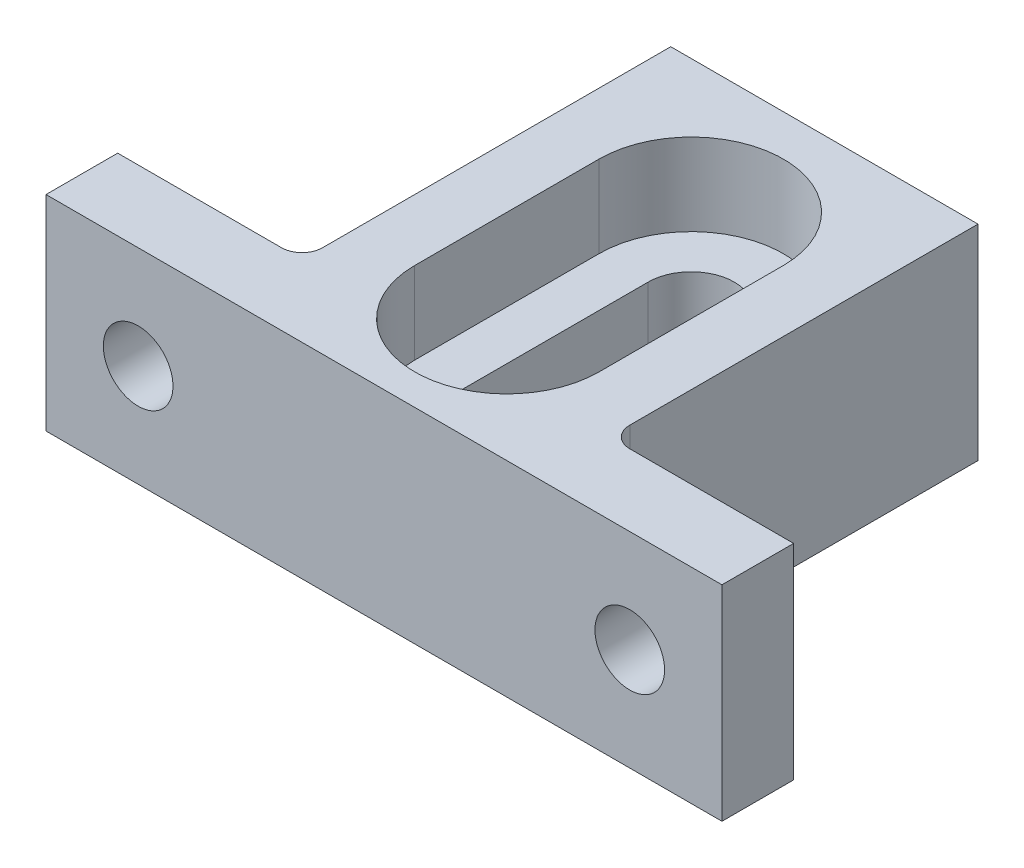
ISO-10303-21;
HEADER;
FILE_DESCRIPTION(('STEP AP214'),'2;1');
FILE_NAME('part.step','',(''),(''),'','','');
FILE_SCHEMA(('AUTOMOTIVE_DESIGN { 1 0 10303 214 1 1 1 1 }'));
ENDSEC;
DATA;
#1=APPLICATION_CONTEXT('core data for automotive mechanical design processes');
#2=APPLICATION_PROTOCOL_DEFINITION('international standard','automotive_design',2000,#1);
#3=PRODUCT_CONTEXT('',#1,'mechanical');
#4=PRODUCT('Part','Part','',(#3));
#5=PRODUCT_RELATED_PRODUCT_CATEGORY('part','',(#4));
#6=PRODUCT_DEFINITION_FORMATION('','',#4);
#7=PRODUCT_DEFINITION_CONTEXT('part definition',#1,'design');
#8=PRODUCT_DEFINITION('design','',#6,#7);
#9=PRODUCT_DEFINITION_SHAPE('','',#8);
#10=(LENGTH_UNIT() NAMED_UNIT(*) SI_UNIT(.MILLI.,.METRE.));
#11=(NAMED_UNIT(*) PLANE_ANGLE_UNIT() SI_UNIT($,.RADIAN.));
#12=(NAMED_UNIT(*) SI_UNIT($,.STERADIAN.) SOLID_ANGLE_UNIT());
#13=UNCERTAINTY_MEASURE_WITH_UNIT(LENGTH_MEASURE(1.E-05),#10,'distance_accuracy_value','');
#14=(GEOMETRIC_REPRESENTATION_CONTEXT(3) GLOBAL_UNCERTAINTY_ASSIGNED_CONTEXT((#13)) GLOBAL_UNIT_ASSIGNED_CONTEXT((#10,
#11,#12)) REPRESENTATION_CONTEXT('',''));
#15=CARTESIAN_POINT('',(0.,0.,0.));
#16=DIRECTION('',(0.,0.,1.));
#17=DIRECTION('',(1.,0.,0.));
#18=AXIS2_PLACEMENT_3D('',#15,#16,#17);
#19=CARTESIAN_POINT('',(-7.5,-5.,-3.5));
#20=DIRECTION('',(0.,0.,-1.));
#21=DIRECTION('',(-1.,0.,0.));
#22=AXIS2_PLACEMENT_3D('',#19,#20,#21);
#23=PLANE('',#22);
#24=CARTESIAN_POINT('',(-12.,0.,-3.5));
#25=DIRECTION('',(0.,0.,-1.));
#26=DIRECTION('',(-1.,0.,0.));
#27=AXIS2_PLACEMENT_3D('',#24,#25,#26);
#28=CIRCLE('',#27,1.7);
#29=CARTESIAN_POINT('',(-13.7,0.,-3.5));
#30=VERTEX_POINT('',#29);
#31=EDGE_CURVE('E183',#30,#30,#28,.T.);
#32=ORIENTED_EDGE('',*,*,#31,.F.);
#33=EDGE_LOOP('',(#32));
#34=FACE_BOUND('',#33,.T.);
#35=DIRECTION('',(-1.,0.,0.));
#36=VECTOR('',#35,1.);
#37=CARTESIAN_POINT('',(-7.5,5.,-3.5));
#38=LINE('',#37,#36);
#39=CARTESIAN_POINT('',(-8.5,5.,-3.5));
#40=VERTEX_POINT('',#39);
#41=CARTESIAN_POINT('',(-16.5,5.,-3.5));
#42=VERTEX_POINT('',#41);
#43=EDGE_CURVE('E221',#40,#42,#38,.T.);
#44=ORIENTED_EDGE('',*,*,#43,.F.);
#45=DIRECTION('',(0.,1.,0.));
#46=VECTOR('',#45,1.);
#47=CARTESIAN_POINT('',(-8.5,-5.,-3.5));
#48=LINE('',#47,#46);
#49=CARTESIAN_POINT('',(-8.5,-5.,-3.5));
#50=VERTEX_POINT('',#49);
#51=EDGE_CURVE('E296',#40,#50,#48,.F.);
#52=ORIENTED_EDGE('',*,*,#51,.T.);
#53=DIRECTION('',(-1.,0.,0.));
#54=VECTOR('',#53,1.);
#55=CARTESIAN_POINT('',(-7.5,-5.,-3.5));
#56=LINE('',#55,#54);
#57=CARTESIAN_POINT('',(-16.5,-5.,-3.5));
#58=VERTEX_POINT('',#57);
#59=EDGE_CURVE('E228',#50,#58,#56,.T.);
#60=ORIENTED_EDGE('',*,*,#59,.T.);
#61=DIRECTION('',(0.,1.,0.));
#62=VECTOR('',#61,1.);
#63=CARTESIAN_POINT('',(-16.5,-5.,-3.5));
#64=LINE('',#63,#62);
#65=EDGE_CURVE('E251',#58,#42,#64,.T.);
#66=ORIENTED_EDGE('',*,*,#65,.T.);
#67=EDGE_LOOP('',(#44,#52,#60,#66));
#68=FACE_BOUND('',#67,.T.);
#69=ADVANCED_FACE('F31',(#34,#68),#23,.T.);
#70=CARTESIAN_POINT('',(-7.5,-5.,-21.5));
#71=DIRECTION('',(-1.,0.,0.));
#72=DIRECTION('',(0.,0.,1.));
#73=AXIS2_PLACEMENT_3D('',#70,#71,#72);
#74=PLANE('',#73);
#75=DIRECTION('',(0.,0.,1.));
#76=VECTOR('',#75,1.);
#77=CARTESIAN_POINT('',(-7.5,-5.,-21.5));
#78=LINE('',#77,#76);
#79=CARTESIAN_POINT('',(-7.5,-5.,-21.5));
#80=VERTEX_POINT('',#79);
#81=CARTESIAN_POINT('',(-7.5,-5.,-4.5));
#82=VERTEX_POINT('',#81);
#83=EDGE_CURVE('E248',#80,#82,#78,.T.);
#84=ORIENTED_EDGE('',*,*,#83,.T.);
#85=DIRECTION('',(0.,1.,0.));
#86=VECTOR('',#85,1.);
#87=CARTESIAN_POINT('',(-7.5,5.,-4.5));
#88=LINE('',#87,#86);
#89=CARTESIAN_POINT('',(-7.5,5.,-4.5));
#90=VERTEX_POINT('',#89);
#91=EDGE_CURVE('E293',#82,#90,#88,.T.);
#92=ORIENTED_EDGE('',*,*,#91,.T.);
#93=DIRECTION('',(0.,0.,1.));
#94=VECTOR('',#93,1.);
#95=CARTESIAN_POINT('',(-7.5,5.,-21.5));
#96=LINE('',#95,#94);
#97=CARTESIAN_POINT('',(-7.5,5.,-21.5));
#98=VERTEX_POINT('',#97);
#99=EDGE_CURVE('E231',#98,#90,#96,.T.);
#100=ORIENTED_EDGE('',*,*,#99,.F.);
#101=DIRECTION('',(0.,1.,0.));
#102=VECTOR('',#101,1.);
#103=CARTESIAN_POINT('',(-7.5,-5.,-21.5));
#104=LINE('',#103,#102);
#105=EDGE_CURVE('E271',#80,#98,#104,.T.);
#106=ORIENTED_EDGE('',*,*,#105,.F.);
#107=EDGE_LOOP('',(#84,#92,#100,#106));
#108=FACE_BOUND('',#107,.T.);
#109=ADVANCED_FACE('F314',(#108),#74,.T.);
#110=CARTESIAN_POINT('',(-7.5,-5.,-21.5));
#111=DIRECTION('',(0.,0.,-1.));
#112=DIRECTION('',(-1.,0.,0.));
#113=AXIS2_PLACEMENT_3D('',#110,#111,#112);
#114=PLANE('',#113);
#115=DIRECTION('',(-1.,0.,0.));
#116=VECTOR('',#115,1.);
#117=CARTESIAN_POINT('',(-7.5,5.,-21.5));
#118=LINE('',#117,#116);
#119=CARTESIAN_POINT('',(7.5,5.,-21.5));
#120=VERTEX_POINT('',#119);
#121=EDGE_CURVE('E266',#120,#98,#118,.T.);
#122=ORIENTED_EDGE('',*,*,#121,.F.);
#123=DIRECTION('',(0.,1.,0.));
#124=VECTOR('',#123,1.);
#125=CARTESIAN_POINT('',(7.5,-5.,-21.5));
#126=LINE('',#125,#124);
#127=CARTESIAN_POINT('',(7.5,-5.,-21.5));
#128=VERTEX_POINT('',#127);
#129=EDGE_CURVE('E274',#128,#120,#126,.T.);
#130=ORIENTED_EDGE('',*,*,#129,.F.);
#131=DIRECTION('',(-1.,0.,0.));
#132=VECTOR('',#131,1.);
#133=CARTESIAN_POINT('',(-7.5,-5.,-21.5));
#134=LINE('',#133,#132);
#135=EDGE_CURVE('E245',#128,#80,#134,.T.);
#136=ORIENTED_EDGE('',*,*,#135,.T.);
#137=ORIENTED_EDGE('',*,*,#105,.T.);
#138=EDGE_LOOP('',(#122,#130,#136,#137));
#139=FACE_BOUND('',#138,.T.);
#140=ADVANCED_FACE('F343',(#139),#114,.T.);
#141=CARTESIAN_POINT('',(7.5,-5.,-21.5));
#142=DIRECTION('',(1.,0.,0.));
#143=DIRECTION('',(0.,0.,-1.));
#144=AXIS2_PLACEMENT_3D('',#141,#142,#143);
#145=PLANE('',#144);
#146=DIRECTION('',(0.,0.,-1.));
#147=VECTOR('',#146,1.);
#148=CARTESIAN_POINT('',(7.5,5.,-21.5));
#149=LINE('',#148,#147);
#150=CARTESIAN_POINT('',(7.5,5.,-4.5));
#151=VERTEX_POINT('',#150);
#152=EDGE_CURVE('E264',#151,#120,#149,.T.);
#153=ORIENTED_EDGE('',*,*,#152,.F.);
#154=DIRECTION('',(0.,1.,0.));
#155=VECTOR('',#154,1.);
#156=CARTESIAN_POINT('',(7.5,-5.,-4.5));
#157=LINE('',#156,#155);
#158=CARTESIAN_POINT('',(7.5,-5.,-4.5));
#159=VERTEX_POINT('',#158);
#160=EDGE_CURVE('E46',#151,#159,#157,.F.);
#161=ORIENTED_EDGE('',*,*,#160,.T.);
#162=DIRECTION('',(0.,0.,-1.));
#163=VECTOR('',#162,1.);
#164=CARTESIAN_POINT('',(7.5,-5.,-21.5));
#165=LINE('',#164,#163);
#166=EDGE_CURVE('E243',#159,#128,#165,.T.);
#167=ORIENTED_EDGE('',*,*,#166,.T.);
#168=ORIENTED_EDGE('',*,*,#129,.T.);
#169=EDGE_LOOP('',(#153,#161,#167,#168));
#170=FACE_BOUND('',#169,.T.);
#171=ADVANCED_FACE('F340',(#170),#145,.T.);
#172=CARTESIAN_POINT('',(7.5,-5.,-3.5));
#173=DIRECTION('',(0.,0.,-1.));
#174=DIRECTION('',(-1.,0.,0.));
#175=AXIS2_PLACEMENT_3D('',#172,#173,#174);
#176=PLANE('',#175);
#177=CARTESIAN_POINT('',(12.,0.,-3.5));
#178=DIRECTION('',(0.,0.,-1.));
#179=DIRECTION('',(-1.,0.,0.));
#180=AXIS2_PLACEMENT_3D('',#177,#178,#179);
#181=CIRCLE('',#180,1.7);
#182=CARTESIAN_POINT('',(10.3,0.,-3.5));
#183=VERTEX_POINT('',#182);
#184=EDGE_CURVE('E557',#183,#183,#181,.T.);
#185=ORIENTED_EDGE('',*,*,#184,.F.);
#186=EDGE_LOOP('',(#185));
#187=FACE_BOUND('',#186,.T.);
#188=DIRECTION('',(-1.,0.,0.));
#189=VECTOR('',#188,1.);
#190=CARTESIAN_POINT('',(7.5,-5.,-3.5));
#191=LINE('',#190,#189);
#192=CARTESIAN_POINT('',(16.5,-5.,-3.5));
#193=VERTEX_POINT('',#192);
#194=CARTESIAN_POINT('',(8.5,-5.,-3.5));
#195=VERTEX_POINT('',#194);
#196=EDGE_CURVE('E240',#193,#195,#191,.T.);
#197=ORIENTED_EDGE('',*,*,#196,.T.);
#198=DIRECTION('',(0.,1.,0.));
#199=VECTOR('',#198,1.);
#200=CARTESIAN_POINT('',(8.5,5.,-3.5));
#201=LINE('',#200,#199);
#202=CARTESIAN_POINT('',(8.5,5.,-3.5));
#203=VERTEX_POINT('',#202);
#204=EDGE_CURVE('E298',#195,#203,#201,.T.);
#205=ORIENTED_EDGE('',*,*,#204,.T.);
#206=DIRECTION('',(-1.,0.,0.));
#207=VECTOR('',#206,1.);
#208=CARTESIAN_POINT('',(7.5,5.,-3.5));
#209=LINE('',#208,#207);
#210=CARTESIAN_POINT('',(16.5,5.,-3.5));
#211=VERTEX_POINT('',#210);
#212=EDGE_CURVE('E262',#211,#203,#209,.T.);
#213=ORIENTED_EDGE('',*,*,#212,.F.);
#214=DIRECTION('',(0.,1.,0.));
#215=VECTOR('',#214,1.);
#216=CARTESIAN_POINT('',(16.5,-5.,-3.5));
#217=LINE('',#216,#215);
#218=EDGE_CURVE('E277',#193,#211,#217,.T.);
#219=ORIENTED_EDGE('',*,*,#218,.F.);
#220=EDGE_LOOP('',(#197,#205,#213,#219));
#221=FACE_BOUND('',#220,.T.);
#222=ADVANCED_FACE('F335',(#187,#221),#176,.T.);
#223=CARTESIAN_POINT('',(16.5,-5.,-3.5));
#224=DIRECTION('',(1.,0.,0.));
#225=DIRECTION('',(0.,0.,-1.));
#226=AXIS2_PLACEMENT_3D('',#223,#224,#225);
#227=PLANE('',#226);
#228=DIRECTION('',(0.,0.,-1.));
#229=VECTOR('',#228,1.);
#230=CARTESIAN_POINT('',(16.5,5.,-3.5));
#231=LINE('',#230,#229);
#232=CARTESIAN_POINT('',(16.5,5.,0.));
#233=VERTEX_POINT('',#232);
#234=EDGE_CURVE('E259',#233,#211,#231,.T.);
#235=ORIENTED_EDGE('',*,*,#234,.F.);
#236=DIRECTION('',(0.,1.,0.));
#237=VECTOR('',#236,1.);
#238=CARTESIAN_POINT('',(16.5,-5.,0.));
#239=LINE('',#238,#237);
#240=CARTESIAN_POINT('',(16.5,-5.,0.));
#241=VERTEX_POINT('',#240);
#242=EDGE_CURVE('E279',#241,#233,#239,.T.);
#243=ORIENTED_EDGE('',*,*,#242,.F.);
#244=DIRECTION('',(0.,0.,-1.));
#245=VECTOR('',#244,1.);
#246=CARTESIAN_POINT('',(16.5,-5.,-3.5));
#247=LINE('',#246,#245);
#248=EDGE_CURVE('E237',#241,#193,#247,.T.);
#249=ORIENTED_EDGE('',*,*,#248,.T.);
#250=ORIENTED_EDGE('',*,*,#218,.T.);
#251=EDGE_LOOP('',(#235,#243,#249,#250));
#252=FACE_BOUND('',#251,.T.);
#253=ADVANCED_FACE('F331',(#252),#227,.T.);
#254=CARTESIAN_POINT('',(16.5,-5.,0.));
#255=DIRECTION('',(0.,0.,1.));
#256=DIRECTION('',(1.,0.,0.));
#257=AXIS2_PLACEMENT_3D('',#254,#255,#256);
#258=PLANE('',#257);
#259=CARTESIAN_POINT('',(12.,0.,0.));
#260=DIRECTION('',(0.,0.,-1.));
#261=DIRECTION('',(-1.,0.,0.));
#262=AXIS2_PLACEMENT_3D('',#259,#260,#261);
#263=CIRCLE('',#262,1.7);
#264=CARTESIAN_POINT('',(10.3,0.,0.));
#265=VERTEX_POINT('',#264);
#266=EDGE_CURVE('E553',#265,#265,#263,.T.);
#267=ORIENTED_EDGE('',*,*,#266,.T.);
#268=EDGE_LOOP('',(#267));
#269=FACE_BOUND('',#268,.T.);
#270=CARTESIAN_POINT('',(-12.,0.,0.));
#271=DIRECTION('',(0.,0.,-1.));
#272=DIRECTION('',(-1.,0.,0.));
#273=AXIS2_PLACEMENT_3D('',#270,#271,#272);
#274=CIRCLE('',#273,1.7);
#275=CARTESIAN_POINT('',(-13.7,0.,0.));
#276=VERTEX_POINT('',#275);
#277=EDGE_CURVE('E180',#276,#276,#274,.T.);
#278=ORIENTED_EDGE('',*,*,#277,.T.);
#279=EDGE_LOOP('',(#278));
#280=FACE_BOUND('',#279,.T.);
#281=DIRECTION('',(1.,0.,0.));
#282=VECTOR('',#281,1.);
#283=CARTESIAN_POINT('',(16.5,5.,0.));
#284=LINE('',#283,#282);
#285=CARTESIAN_POINT('',(-16.5,5.,0.));
#286=VERTEX_POINT('',#285);
#287=EDGE_CURVE('E256',#286,#233,#284,.T.);
#288=ORIENTED_EDGE('',*,*,#287,.F.);
#289=DIRECTION('',(0.,1.,0.));
#290=VECTOR('',#289,1.);
#291=CARTESIAN_POINT('',(-16.5,-5.,0.));
#292=LINE('',#291,#290);
#293=CARTESIAN_POINT('',(-16.5,-5.,0.));
#294=VERTEX_POINT('',#293);
#295=EDGE_CURVE('E281',#294,#286,#292,.T.);
#296=ORIENTED_EDGE('',*,*,#295,.F.);
#297=DIRECTION('',(1.,0.,0.));
#298=VECTOR('',#297,1.);
#299=CARTESIAN_POINT('',(16.5,-5.,0.));
#300=LINE('',#299,#298);
#301=EDGE_CURVE('E234',#294,#241,#300,.T.);
#302=ORIENTED_EDGE('',*,*,#301,.T.);
#303=ORIENTED_EDGE('',*,*,#242,.T.);
#304=EDGE_LOOP('',(#288,#296,#302,#303));
#305=FACE_BOUND('',#304,.T.);
#306=ADVANCED_FACE('F327',(#269,#280,#305),#258,.T.);
#307=CARTESIAN_POINT('',(-16.5,-5.,-3.5));
#308=DIRECTION('',(-1.,0.,0.));
#309=DIRECTION('',(0.,0.,1.));
#310=AXIS2_PLACEMENT_3D('',#307,#308,#309);
#311=PLANE('',#310);
#312=DIRECTION('',(0.,0.,1.));
#313=VECTOR('',#312,1.);
#314=CARTESIAN_POINT('',(-16.5,5.,-3.5));
#315=LINE('',#314,#313);
#316=EDGE_CURVE('E253',#42,#286,#315,.T.);
#317=ORIENTED_EDGE('',*,*,#316,.F.);
#318=ORIENTED_EDGE('',*,*,#65,.F.);
#319=DIRECTION('',(0.,0.,1.));
#320=VECTOR('',#319,1.);
#321=CARTESIAN_POINT('',(-16.5,-5.,-3.5));
#322=LINE('',#321,#320);
#323=EDGE_CURVE('E230',#58,#294,#322,.T.);
#324=ORIENTED_EDGE('',*,*,#323,.T.);
#325=ORIENTED_EDGE('',*,*,#295,.T.);
#326=EDGE_LOOP('',(#317,#318,#324,#325));
#327=FACE_BOUND('',#326,.T.);
#328=ADVANCED_FACE('F323',(#327),#311,.T.);
#329=CARTESIAN_POINT('',(-16.5,-5.,-3.5));
#330=DIRECTION('',(0.,1.,0.));
#331=DIRECTION('',(0.,0.,1.));
#332=AXIS2_PLACEMENT_3D('',#329,#330,#331);
#333=PLANE('',#332);
#334=DIRECTION('',(0.,0.,1.));
#335=VECTOR('',#334,1.);
#336=CARTESIAN_POINT('',(-2.1,-5.,-6.));
#337=LINE('',#336,#335);
#338=CARTESIAN_POINT('',(-2.1,-5.,-15.));
#339=VERTEX_POINT('',#338);
#340=CARTESIAN_POINT('',(-2.1,-5.,-6.));
#341=VERTEX_POINT('',#340);
#342=EDGE_CURVE('E166',#339,#341,#337,.T.);
#343=ORIENTED_EDGE('',*,*,#342,.T.);
#344=CARTESIAN_POINT('',(0.,-5.,-6.));
#345=DIRECTION('',(0.,1.,0.));
#346=DIRECTION('',(0.,0.,-1.));
#347=AXIS2_PLACEMENT_3D('',#344,#345,#346);
#348=CIRCLE('',#347,2.1);
#349=CARTESIAN_POINT('',(2.1,-5.,-6.));
#350=VERTEX_POINT('',#349);
#351=EDGE_CURVE('E159',#341,#350,#348,.T.);
#352=ORIENTED_EDGE('',*,*,#351,.T.);
#353=DIRECTION('',(0.,0.,-1.));
#354=VECTOR('',#353,1.);
#355=CARTESIAN_POINT('',(2.1,-5.,-6.));
#356=LINE('',#355,#354);
#357=CARTESIAN_POINT('',(2.1,-5.,-15.));
#358=VERTEX_POINT('',#357);
#359=EDGE_CURVE('E170',#350,#358,#356,.T.);
#360=ORIENTED_EDGE('',*,*,#359,.T.);
#361=CARTESIAN_POINT('',(0.,-5.,-15.));
#362=DIRECTION('',(0.,1.,0.));
#363=DIRECTION('',(0.,0.,1.));
#364=AXIS2_PLACEMENT_3D('',#361,#362,#363);
#365=CIRCLE('',#364,2.1);
#366=EDGE_CURVE('E175',#358,#339,#365,.T.);
#367=ORIENTED_EDGE('',*,*,#366,.T.);
#368=EDGE_LOOP('',(#343,#352,#360,#367));
#369=FACE_BOUND('',#368,.T.);
#370=ORIENTED_EDGE('',*,*,#59,.F.);
#371=CARTESIAN_POINT('',(-8.5,-5.,-4.5));
#372=DIRECTION('',(0.,1.,0.));
#373=DIRECTION('',(0.,0.,1.));
#374=AXIS2_PLACEMENT_3D('',#371,#372,#373);
#375=CIRCLE('',#374,1.);
#376=EDGE_CURVE('E304',#50,#82,#375,.T.);
#377=ORIENTED_EDGE('',*,*,#376,.T.);
#378=ORIENTED_EDGE('',*,*,#83,.F.);
#379=ORIENTED_EDGE('',*,*,#135,.F.);
#380=ORIENTED_EDGE('',*,*,#166,.F.);
#381=CARTESIAN_POINT('',(8.5,-5.,-4.5));
#382=DIRECTION('',(0.,1.,0.));
#383=DIRECTION('',(0.,0.,1.));
#384=AXIS2_PLACEMENT_3D('',#381,#382,#383);
#385=CIRCLE('',#384,1.);
#386=EDGE_CURVE('E11',#159,#195,#385,.T.);
#387=ORIENTED_EDGE('',*,*,#386,.T.);
#388=ORIENTED_EDGE('',*,*,#196,.F.);
#389=ORIENTED_EDGE('',*,*,#248,.F.);
#390=ORIENTED_EDGE('',*,*,#301,.F.);
#391=ORIENTED_EDGE('',*,*,#323,.F.);
#392=EDGE_LOOP('',(#370,#377,#378,#379,#380,#387,#388,#389,#390,#391));
#393=FACE_BOUND('',#392,.T.);
#394=ADVANCED_FACE('F177',(#369,#393),#333,.F.);
#395=CARTESIAN_POINT('',(-16.5,5.,-3.5));
#396=DIRECTION('',(0.,1.,0.));
#397=DIRECTION('',(0.,0.,1.));
#398=AXIS2_PLACEMENT_3D('',#395,#396,#397);
#399=PLANE('',#398);
#400=CARTESIAN_POINT('',(0.,5.,-6.));
#401=DIRECTION('',(0.,1.,0.));
#402=DIRECTION('',(0.,0.,-1.));
#403=AXIS2_PLACEMENT_3D('',#400,#401,#402);
#404=CIRCLE('',#403,4.5);
#405=CARTESIAN_POINT('',(-4.5,5.,-6.));
#406=VERTEX_POINT('',#405);
#407=CARTESIAN_POINT('',(4.5,5.,-6.));
#408=VERTEX_POINT('',#407);
#409=EDGE_CURVE('E191',#406,#408,#404,.T.);
#410=ORIENTED_EDGE('',*,*,#409,.F.);
#411=DIRECTION('',(0.,0.,1.));
#412=VECTOR('',#411,1.);
#413=CARTESIAN_POINT('',(-4.5,5.,-6.));
#414=LINE('',#413,#412);
#415=CARTESIAN_POINT('',(-4.5,5.,-15.));
#416=VERTEX_POINT('',#415);
#417=EDGE_CURVE('E200',#416,#406,#414,.T.);
#418=ORIENTED_EDGE('',*,*,#417,.F.);
#419=CARTESIAN_POINT('',(0.,5.,-15.));
#420=DIRECTION('',(0.,1.,0.));
#421=DIRECTION('',(0.,0.,1.));
#422=AXIS2_PLACEMENT_3D('',#419,#420,#421);
#423=CIRCLE('',#422,4.5);
#424=CARTESIAN_POINT('',(4.5,5.,-15.));
#425=VERTEX_POINT('',#424);
#426=EDGE_CURVE('E214',#425,#416,#423,.T.);
#427=ORIENTED_EDGE('',*,*,#426,.F.);
#428=DIRECTION('',(0.,0.,-1.));
#429=VECTOR('',#428,1.);
#430=CARTESIAN_POINT('',(4.5,5.,-6.));
#431=LINE('',#430,#429);
#432=EDGE_CURVE('E211',#408,#425,#431,.T.);
#433=ORIENTED_EDGE('',*,*,#432,.F.);
#434=EDGE_LOOP('',(#410,#418,#427,#433));
#435=FACE_BOUND('',#434,.T.);
#436=ORIENTED_EDGE('',*,*,#99,.T.);
#437=CARTESIAN_POINT('',(-8.5,5.,-4.5));
#438=DIRECTION('',(0.,1.,0.));
#439=DIRECTION('',(0.,0.,1.));
#440=AXIS2_PLACEMENT_3D('',#437,#438,#439);
#441=CIRCLE('',#440,1.);
#442=EDGE_CURVE('E302',#90,#40,#441,.F.);
#443=ORIENTED_EDGE('',*,*,#442,.T.);
#444=ORIENTED_EDGE('',*,*,#43,.T.);
#445=ORIENTED_EDGE('',*,*,#316,.T.);
#446=ORIENTED_EDGE('',*,*,#287,.T.);
#447=ORIENTED_EDGE('',*,*,#234,.T.);
#448=ORIENTED_EDGE('',*,*,#212,.T.);
#449=CARTESIAN_POINT('',(8.5,5.,-4.5));
#450=DIRECTION('',(0.,1.,0.));
#451=DIRECTION('',(0.,0.,1.));
#452=AXIS2_PLACEMENT_3D('',#449,#450,#451);
#453=CIRCLE('',#452,1.);
#454=EDGE_CURVE('E39',#203,#151,#453,.F.);
#455=ORIENTED_EDGE('',*,*,#454,.T.);
#456=ORIENTED_EDGE('',*,*,#152,.T.);
#457=ORIENTED_EDGE('',*,*,#121,.T.);
#458=EDGE_LOOP('',(#436,#443,#444,#445,#446,#447,#448,#455,#456,#457));
#459=FACE_BOUND('',#458,.T.);
#460=ADVANCED_FACE('F318',(#435,#459),#399,.T.);
#461=CARTESIAN_POINT('',(0.,1.,-6.));
#462=DIRECTION('',(0.,1.,0.));
#463=DIRECTION('',(0.,0.,1.));
#464=AXIS2_PLACEMENT_3D('',#461,#462,#463);
#465=CYLINDRICAL_SURFACE('',#464,4.5);
#466=ORIENTED_EDGE('',*,*,#409,.T.);
#467=DIRECTION('',(0.,1.,0.));
#468=VECTOR('',#467,1.);
#469=CARTESIAN_POINT('',(4.5,1.,-6.));
#470=LINE('',#469,#468);
#471=CARTESIAN_POINT('',(4.5,1.,-6.));
#472=VERTEX_POINT('',#471);
#473=EDGE_CURVE('E209',#472,#408,#470,.T.);
#474=ORIENTED_EDGE('',*,*,#473,.F.);
#475=CARTESIAN_POINT('',(0.,1.,-6.));
#476=DIRECTION('',(0.,1.,0.));
#477=DIRECTION('',(0.,0.,-1.));
#478=AXIS2_PLACEMENT_3D('',#475,#476,#477);
#479=CIRCLE('',#478,4.5);
#480=CARTESIAN_POINT('',(-4.5,1.,-6.));
#481=VERTEX_POINT('',#480);
#482=EDGE_CURVE('E196',#481,#472,#479,.T.);
#483=ORIENTED_EDGE('',*,*,#482,.F.);
#484=DIRECTION('',(0.,1.,0.));
#485=VECTOR('',#484,1.);
#486=CARTESIAN_POINT('',(-4.5,1.,-6.));
#487=LINE('',#486,#485);
#488=EDGE_CURVE('E219',#481,#406,#487,.T.);
#489=ORIENTED_EDGE('',*,*,#488,.T.);
#490=EDGE_LOOP('',(#466,#474,#483,#489));
#491=FACE_BOUND('',#490,.T.);
#492=ADVANCED_FACE('F398',(#491),#465,.F.);
#493=CARTESIAN_POINT('',(-4.5,1.,-6.));
#494=DIRECTION('',(-1.,0.,0.));
#495=DIRECTION('',(0.,0.,1.));
#496=AXIS2_PLACEMENT_3D('',#493,#494,#495);
#497=PLANE('',#496);
#498=ORIENTED_EDGE('',*,*,#417,.T.);
#499=ORIENTED_EDGE('',*,*,#488,.F.);
#500=DIRECTION('',(0.,0.,1.));
#501=VECTOR('',#500,1.);
#502=CARTESIAN_POINT('',(-4.5,1.,-6.));
#503=LINE('',#502,#501);
#504=CARTESIAN_POINT('',(-4.5,1.,-15.));
#505=VERTEX_POINT('',#504);
#506=EDGE_CURVE('E206',#505,#481,#503,.T.);
#507=ORIENTED_EDGE('',*,*,#506,.F.);
#508=DIRECTION('',(0.,1.,0.));
#509=VECTOR('',#508,1.);
#510=CARTESIAN_POINT('',(-4.5,1.,-15.));
#511=LINE('',#510,#509);
#512=EDGE_CURVE('E222',#505,#416,#511,.T.);
#513=ORIENTED_EDGE('',*,*,#512,.T.);
#514=EDGE_LOOP('',(#498,#499,#507,#513));
#515=FACE_BOUND('',#514,.T.);
#516=ADVANCED_FACE('F394',(#515),#497,.F.);
#517=CARTESIAN_POINT('',(0.,1.,-15.));
#518=DIRECTION('',(0.,1.,0.));
#519=DIRECTION('',(0.,0.,1.));
#520=AXIS2_PLACEMENT_3D('',#517,#518,#519);
#521=CYLINDRICAL_SURFACE('',#520,4.5);
#522=ORIENTED_EDGE('',*,*,#426,.T.);
#523=ORIENTED_EDGE('',*,*,#512,.F.);
#524=CARTESIAN_POINT('',(0.,1.,-15.));
#525=DIRECTION('',(0.,1.,0.));
#526=DIRECTION('',(0.,0.,1.));
#527=AXIS2_PLACEMENT_3D('',#524,#525,#526);
#528=CIRCLE('',#527,4.5);
#529=CARTESIAN_POINT('',(4.5,1.,-15.));
#530=VERTEX_POINT('',#529);
#531=EDGE_CURVE('E203',#530,#505,#528,.T.);
#532=ORIENTED_EDGE('',*,*,#531,.F.);
#533=DIRECTION('',(0.,1.,0.));
#534=VECTOR('',#533,1.);
#535=CARTESIAN_POINT('',(4.5,1.,-15.));
#536=LINE('',#535,#534);
#537=EDGE_CURVE('E224',#530,#425,#536,.T.);
#538=ORIENTED_EDGE('',*,*,#537,.T.);
#539=EDGE_LOOP('',(#522,#523,#532,#538));
#540=FACE_BOUND('',#539,.T.);
#541=ADVANCED_FACE('F397',(#540),#521,.F.);
#542=CARTESIAN_POINT('',(4.5,1.,-6.));
#543=DIRECTION('',(1.,0.,0.));
#544=DIRECTION('',(0.,0.,-1.));
#545=AXIS2_PLACEMENT_3D('',#542,#543,#544);
#546=PLANE('',#545);
#547=ORIENTED_EDGE('',*,*,#432,.T.);
#548=ORIENTED_EDGE('',*,*,#537,.F.);
#549=DIRECTION('',(0.,0.,-1.));
#550=VECTOR('',#549,1.);
#551=CARTESIAN_POINT('',(4.5,1.,-6.));
#552=LINE('',#551,#550);
#553=EDGE_CURVE('E199',#472,#530,#552,.T.);
#554=ORIENTED_EDGE('',*,*,#553,.F.);
#555=ORIENTED_EDGE('',*,*,#473,.T.);
#556=EDGE_LOOP('',(#547,#548,#554,#555));
#557=FACE_BOUND('',#556,.T.);
#558=ADVANCED_FACE('F392',(#557),#546,.F.);
#559=CARTESIAN_POINT('',(0.,1.,-6.));
#560=DIRECTION('',(0.,-1.,0.));
#561=DIRECTION('',(0.,0.,-1.));
#562=AXIS2_PLACEMENT_3D('',#559,#560,#561);
#563=PLANE('',#562);
#564=DIRECTION('',(0.,0.,1.));
#565=VECTOR('',#564,1.);
#566=CARTESIAN_POINT('',(2.1,1.,-6.));
#567=LINE('',#566,#565);
#568=CARTESIAN_POINT('',(2.1,1.,-15.));
#569=VERTEX_POINT('',#568);
#570=CARTESIAN_POINT('',(2.1,1.,-6.));
#571=VERTEX_POINT('',#570);
#572=EDGE_CURVE('E273',#569,#571,#567,.T.);
#573=ORIENTED_EDGE('',*,*,#572,.T.);
#574=CARTESIAN_POINT('',(0.,1.,-6.));
#575=DIRECTION('',(0.,-1.,0.));
#576=DIRECTION('',(0.,0.,-1.));
#577=AXIS2_PLACEMENT_3D('',#574,#575,#576);
#578=CIRCLE('',#577,2.1);
#579=CARTESIAN_POINT('',(-2.1,1.,-6.));
#580=VERTEX_POINT('',#579);
#581=EDGE_CURVE('E162',#571,#580,#578,.T.);
#582=ORIENTED_EDGE('',*,*,#581,.T.);
#583=DIRECTION('',(0.,0.,-1.));
#584=VECTOR('',#583,1.);
#585=CARTESIAN_POINT('',(-2.1,1.,-6.));
#586=LINE('',#585,#584);
#587=CARTESIAN_POINT('',(-2.1,1.,-15.));
#588=VERTEX_POINT('',#587);
#589=EDGE_CURVE('E289',#580,#588,#586,.T.);
#590=ORIENTED_EDGE('',*,*,#589,.T.);
#591=CARTESIAN_POINT('',(0.,1.,-15.));
#592=DIRECTION('',(0.,-1.,0.));
#593=DIRECTION('',(0.,0.,-1.));
#594=AXIS2_PLACEMENT_3D('',#591,#592,#593);
#595=CIRCLE('',#594,2.1);
#596=EDGE_CURVE('E286',#588,#569,#595,.T.);
#597=ORIENTED_EDGE('',*,*,#596,.T.);
#598=EDGE_LOOP('',(#573,#582,#590,#597));
#599=FACE_BOUND('',#598,.T.);
#600=ORIENTED_EDGE('',*,*,#482,.T.);
#601=ORIENTED_EDGE('',*,*,#553,.T.);
#602=ORIENTED_EDGE('',*,*,#531,.T.);
#603=ORIENTED_EDGE('',*,*,#506,.T.);
#604=EDGE_LOOP('',(#600,#601,#602,#603));
#605=FACE_BOUND('',#604,.T.);
#606=ADVANCED_FACE('F389',(#599,#605),#563,.F.);
#607=CARTESIAN_POINT('',(0.,-5.,-6.));
#608=DIRECTION('',(0.,1.,0.));
#609=DIRECTION('',(0.,0.,1.));
#610=AXIS2_PLACEMENT_3D('',#607,#608,#609);
#611=CYLINDRICAL_SURFACE('',#610,2.1);
#612=DIRECTION('',(0.,1.,0.));
#613=VECTOR('',#612,1.);
#614=CARTESIAN_POINT('',(2.1,-5.,-6.));
#615=LINE('',#614,#613);
#616=EDGE_CURVE('E154',#350,#571,#615,.T.);
#617=ORIENTED_EDGE('',*,*,#616,.F.);
#618=ORIENTED_EDGE('',*,*,#351,.F.);
#619=DIRECTION('',(0.,1.,0.));
#620=VECTOR('',#619,1.);
#621=CARTESIAN_POINT('',(-2.1,-5.,-6.));
#622=LINE('',#621,#620);
#623=EDGE_CURVE('E189',#341,#580,#622,.T.);
#624=ORIENTED_EDGE('',*,*,#623,.T.);
#625=ORIENTED_EDGE('',*,*,#581,.F.);
#626=EDGE_LOOP('',(#617,#618,#624,#625));
#627=FACE_BOUND('',#626,.T.);
#628=ADVANCED_FACE('F156',(#627),#611,.F.);
#629=CARTESIAN_POINT('',(-2.1,-5.,-6.));
#630=DIRECTION('',(-1.,0.,0.));
#631=DIRECTION('',(0.,0.,1.));
#632=AXIS2_PLACEMENT_3D('',#629,#630,#631);
#633=PLANE('',#632);
#634=ORIENTED_EDGE('',*,*,#623,.F.);
#635=ORIENTED_EDGE('',*,*,#342,.F.);
#636=DIRECTION('',(0.,1.,0.));
#637=VECTOR('',#636,1.);
#638=CARTESIAN_POINT('',(-2.1,-5.,-15.));
#639=LINE('',#638,#637);
#640=EDGE_CURVE('E192',#339,#588,#639,.T.);
#641=ORIENTED_EDGE('',*,*,#640,.T.);
#642=ORIENTED_EDGE('',*,*,#589,.F.);
#643=EDGE_LOOP('',(#634,#635,#641,#642));
#644=FACE_BOUND('',#643,.T.);
#645=ADVANCED_FACE('F377',(#644),#633,.F.);
#646=CARTESIAN_POINT('',(0.,-5.,-15.));
#647=DIRECTION('',(0.,1.,0.));
#648=DIRECTION('',(0.,0.,1.));
#649=AXIS2_PLACEMENT_3D('',#646,#647,#648);
#650=CYLINDRICAL_SURFACE('',#649,2.1);
#651=ORIENTED_EDGE('',*,*,#640,.F.);
#652=ORIENTED_EDGE('',*,*,#366,.F.);
#653=DIRECTION('',(0.,1.,0.));
#654=VECTOR('',#653,1.);
#655=CARTESIAN_POINT('',(2.1,-5.,-15.));
#656=LINE('',#655,#654);
#657=EDGE_CURVE('E165',#358,#569,#656,.T.);
#658=ORIENTED_EDGE('',*,*,#657,.T.);
#659=ORIENTED_EDGE('',*,*,#596,.F.);
#660=EDGE_LOOP('',(#651,#652,#658,#659));
#661=FACE_BOUND('',#660,.T.);
#662=ADVANCED_FACE('F380',(#661),#650,.F.);
#663=CARTESIAN_POINT('',(2.1,-5.,-6.));
#664=DIRECTION('',(1.,0.,0.));
#665=DIRECTION('',(0.,0.,-1.));
#666=AXIS2_PLACEMENT_3D('',#663,#664,#665);
#667=PLANE('',#666);
#668=ORIENTED_EDGE('',*,*,#657,.F.);
#669=ORIENTED_EDGE('',*,*,#359,.F.);
#670=ORIENTED_EDGE('',*,*,#616,.T.);
#671=ORIENTED_EDGE('',*,*,#572,.F.);
#672=EDGE_LOOP('',(#668,#669,#670,#671));
#673=FACE_BOUND('',#672,.T.);
#674=ADVANCED_FACE('F171',(#673),#667,.F.);
#675=CARTESIAN_POINT('',(-12.,0.,-3.5));
#676=DIRECTION('',(0.,0.,-1.));
#677=DIRECTION('',(-1.,0.,0.));
#678=AXIS2_PLACEMENT_3D('',#675,#676,#677);
#679=CYLINDRICAL_SURFACE('',#678,1.7);
#680=ORIENTED_EDGE('',*,*,#277,.F.);
#681=EDGE_LOOP('',(#680));
#682=FACE_BOUND('',#681,.T.);
#683=ORIENTED_EDGE('',*,*,#31,.T.);
#684=EDGE_LOOP('',(#683));
#685=FACE_BOUND('',#684,.T.);
#686=ADVANCED_FACE('F366',(#682,#685),#679,.F.);
#687=CARTESIAN_POINT('',(12.,0.,-3.5));
#688=DIRECTION('',(0.,0.,-1.));
#689=DIRECTION('',(-1.,0.,0.));
#690=AXIS2_PLACEMENT_3D('',#687,#688,#689);
#691=CYLINDRICAL_SURFACE('',#690,1.7);
#692=ORIENTED_EDGE('',*,*,#266,.F.);
#693=EDGE_LOOP('',(#692));
#694=FACE_BOUND('',#693,.T.);
#695=ORIENTED_EDGE('',*,*,#184,.T.);
#696=EDGE_LOOP('',(#695));
#697=FACE_BOUND('',#696,.T.);
#698=ADVANCED_FACE('F361',(#694,#697),#691,.F.);
#699=CARTESIAN_POINT('',(-8.5,-5.,-4.5));
#700=DIRECTION('',(0.,-1.,0.));
#701=DIRECTION('',(0.,0.,-1.));
#702=AXIS2_PLACEMENT_3D('',#699,#700,#701);
#703=CYLINDRICAL_SURFACE('',#702,1.);
#704=ORIENTED_EDGE('',*,*,#376,.F.);
#705=ORIENTED_EDGE('',*,*,#51,.F.);
#706=ORIENTED_EDGE('',*,*,#442,.F.);
#707=ORIENTED_EDGE('',*,*,#91,.F.);
#708=EDGE_LOOP('',(#704,#705,#706,#707));
#709=FACE_BOUND('',#708,.T.);
#710=ADVANCED_FACE('F316',(#709),#703,.F.);
#711=CARTESIAN_POINT('',(8.5,-5.,-4.5));
#712=DIRECTION('',(0.,-1.,0.));
#713=DIRECTION('',(0.,0.,-1.));
#714=AXIS2_PLACEMENT_3D('',#711,#712,#713);
#715=CYLINDRICAL_SURFACE('',#714,1.);
#716=ORIENTED_EDGE('',*,*,#386,.F.);
#717=ORIENTED_EDGE('',*,*,#160,.F.);
#718=ORIENTED_EDGE('',*,*,#454,.F.);
#719=ORIENTED_EDGE('',*,*,#204,.F.);
#720=EDGE_LOOP('',(#716,#717,#718,#719));
#721=FACE_BOUND('',#720,.T.);
#722=ADVANCED_FACE('F33',(#721),#715,.F.);
#723=CLOSED_SHELL('',(#69,#109,#140,#171,#222,#253,#306,#328,#394,#460,#492,#516,#541,#558,#606,
#628,#645,#662,#674,#686,#698,#710,#722));
#724=MANIFOLD_SOLID_BREP('B2',#723);
#725=ADVANCED_BREP_SHAPE_REPRESENTATION('',(#18,#724),#14);
#726=SHAPE_DEFINITION_REPRESENTATION(#9,#725);
ENDSEC;
END-ISO-10303-21;
